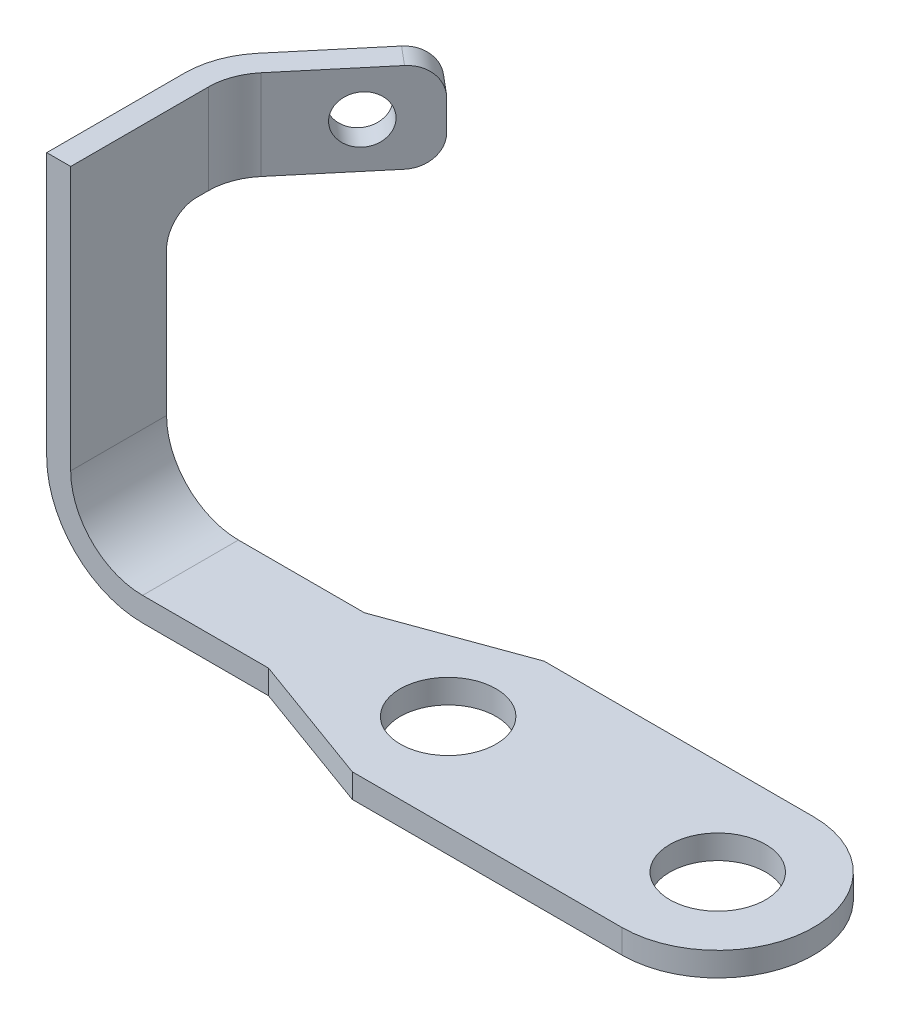
ISO-10303-21;
HEADER;
FILE_DESCRIPTION(('STEP AP214'),'2;1');
FILE_NAME('part.step','',(''),(''),'','','');
FILE_SCHEMA(('AUTOMOTIVE_DESIGN { 1 0 10303 214 1 1 1 1 }'));
ENDSEC;
DATA;
#1=APPLICATION_CONTEXT('core data for automotive mechanical design processes');
#2=APPLICATION_PROTOCOL_DEFINITION('international standard','automotive_design',2000,#1);
#3=PRODUCT_CONTEXT('',#1,'mechanical');
#4=PRODUCT('Part','Part','',(#3));
#5=PRODUCT_RELATED_PRODUCT_CATEGORY('part','',(#4));
#6=PRODUCT_DEFINITION_FORMATION('','',#4);
#7=PRODUCT_DEFINITION_CONTEXT('part definition',#1,'design');
#8=PRODUCT_DEFINITION('design','',#6,#7);
#9=PRODUCT_DEFINITION_SHAPE('','',#8);
#10=(LENGTH_UNIT() NAMED_UNIT(*) SI_UNIT(.MILLI.,.METRE.));
#11=(NAMED_UNIT(*) PLANE_ANGLE_UNIT() SI_UNIT($,.RADIAN.));
#12=(NAMED_UNIT(*) SI_UNIT($,.STERADIAN.) SOLID_ANGLE_UNIT());
#13=UNCERTAINTY_MEASURE_WITH_UNIT(LENGTH_MEASURE(1.E-05),#10,'distance_accuracy_value','');
#14=(GEOMETRIC_REPRESENTATION_CONTEXT(3) GLOBAL_UNCERTAINTY_ASSIGNED_CONTEXT((#13)) GLOBAL_UNIT_ASSIGNED_CONTEXT((#10,
#11,#12)) REPRESENTATION_CONTEXT('',''));
#15=CARTESIAN_POINT('',(0.,0.,0.));
#16=DIRECTION('',(0.,0.,1.));
#17=DIRECTION('',(1.,0.,0.));
#18=AXIS2_PLACEMENT_3D('',#15,#16,#17);
#19=CARTESIAN_POINT('',(-104.,16.,0.));
#20=DIRECTION('',(0.,0.,-1.));
#21=DIRECTION('',(-1.,0.,0.));
#22=AXIS2_PLACEMENT_3D('',#19,#20,#21);
#23=PLANE('',#22);
#24=DIRECTION('',(0.,1.,0.));
#25=VECTOR('',#24,1.);
#26=CARTESIAN_POINT('',(-120.,16.,0.));
#27=LINE('',#26,#25);
#28=CARTESIAN_POINT('',(-120.,16.,0.));
#29=VERTEX_POINT('',#28);
#30=CARTESIAN_POINT('',(-120.,40.,0.));
#31=VERTEX_POINT('',#30);
#32=EDGE_CURVE('E372',#29,#31,#27,.T.);
#33=ORIENTED_EDGE('',*,*,#32,.T.);
#34=DIRECTION('',(-1.,0.,0.));
#35=VECTOR('',#34,1.);
#36=CARTESIAN_POINT('',(-104.,40.,0.));
#37=LINE('',#36,#35);
#38=CARTESIAN_POINT('',(-116.,40.,0.));
#39=VERTEX_POINT('',#38);
#40=EDGE_CURVE('E406',#31,#39,#37,.F.);
#41=ORIENTED_EDGE('',*,*,#40,.T.);
#42=DIRECTION('',(0.,1.,0.));
#43=VECTOR('',#42,1.);
#44=CARTESIAN_POINT('',(-116.,16.,0.));
#45=LINE('',#44,#43);
#46=CARTESIAN_POINT('',(-116.,16.,0.));
#47=VERTEX_POINT('',#46);
#48=EDGE_CURVE('E365',#47,#39,#45,.T.);
#49=ORIENTED_EDGE('',*,*,#48,.F.);
#50=CARTESIAN_POINT('',(-104.,16.,0.));
#51=DIRECTION('',(0.,0.,1.));
#52=DIRECTION('',(1.,0.,0.));
#53=AXIS2_PLACEMENT_3D('',#50,#51,#52);
#54=CIRCLE('',#53,12.);
#55=CARTESIAN_POINT('',(-104.,3.99999999999999,0.));
#56=VERTEX_POINT('',#55);
#57=EDGE_CURVE('E350',#56,#47,#54,.F.);
#58=ORIENTED_EDGE('',*,*,#57,.F.);
#59=DIRECTION('',(-1.,0.,0.));
#60=VECTOR('',#59,1.);
#61=CARTESIAN_POINT('',(0.,4.,0.));
#62=LINE('',#61,#60);
#63=CARTESIAN_POINT('',(-82.979819355637,3.99999999999999,0.));
#64=VERTEX_POINT('',#63);
#65=EDGE_CURVE('E355',#64,#56,#62,.T.);
#66=ORIENTED_EDGE('',*,*,#65,.F.);
#67=DIRECTION('',(0.,1.,0.));
#68=VECTOR('',#67,1.);
#69=CARTESIAN_POINT('',(-82.979819355637,0.,0.));
#70=LINE('',#69,#68);
#71=CARTESIAN_POINT('',(-82.9798193556369,0.,0.));
#72=VERTEX_POINT('',#71);
#73=EDGE_CURVE('E325',#72,#64,#70,.T.);
#74=ORIENTED_EDGE('',*,*,#73,.F.);
#75=DIRECTION('',(-1.,0.,0.));
#76=VECTOR('',#75,1.);
#77=CARTESIAN_POINT('',(0.,0.,0.));
#78=LINE('',#77,#76);
#79=CARTESIAN_POINT('',(-104.,0.,0.));
#80=VERTEX_POINT('',#79);
#81=EDGE_CURVE('E373',#72,#80,#78,.T.);
#82=ORIENTED_EDGE('',*,*,#81,.T.);
#83=CARTESIAN_POINT('',(-104.,16.,0.));
#84=DIRECTION('',(0.,0.,-1.));
#85=DIRECTION('',(-1.,0.,0.));
#86=AXIS2_PLACEMENT_3D('',#83,#84,#85);
#87=CIRCLE('',#86,16.);
#88=EDGE_CURVE('E368',#80,#29,#87,.T.);
#89=ORIENTED_EDGE('',*,*,#88,.T.);
#90=EDGE_LOOP('',(#33,#41,#49,#58,#66,#74,#82,#89));
#91=FACE_BOUND('',#90,.T.);
#92=ADVANCED_FACE('F45',(#91),#23,.T.);
#93=CARTESIAN_POINT('',(-104.,16.,16.));
#94=DIRECTION('',(0.,0.,-1.));
#95=DIRECTION('',(-1.,0.,0.));
#96=AXIS2_PLACEMENT_3D('',#93,#94,#95);
#97=PLANE('',#96);
#98=DIRECTION('',(0.,1.,0.));
#99=VECTOR('',#98,1.);
#100=CARTESIAN_POINT('',(-82.9798193556369,0.,16.));
#101=LINE('',#100,#99);
#102=CARTESIAN_POINT('',(-82.9798193556369,0.,16.));
#103=VERTEX_POINT('',#102);
#104=CARTESIAN_POINT('',(-82.979819355637,3.99999999999999,16.));
#105=VERTEX_POINT('',#104);
#106=EDGE_CURVE('E322',#103,#105,#101,.T.);
#107=ORIENTED_EDGE('',*,*,#106,.T.);
#108=DIRECTION('',(-1.,0.,0.));
#109=VECTOR('',#108,1.);
#110=CARTESIAN_POINT('',(0.,4.,16.));
#111=LINE('',#110,#109);
#112=CARTESIAN_POINT('',(-104.,3.99999999999999,16.));
#113=VERTEX_POINT('',#112);
#114=EDGE_CURVE('E384',#105,#113,#111,.T.);
#115=ORIENTED_EDGE('',*,*,#114,.T.);
#116=CARTESIAN_POINT('',(-104.,16.,16.));
#117=DIRECTION('',(0.,0.,1.));
#118=DIRECTION('',(1.,0.,0.));
#119=AXIS2_PLACEMENT_3D('',#116,#117,#118);
#120=CIRCLE('',#119,12.);
#121=CARTESIAN_POINT('',(-116.,16.,16.));
#122=VERTEX_POINT('',#121);
#123=EDGE_CURVE('E380',#113,#122,#120,.F.);
#124=ORIENTED_EDGE('',*,*,#123,.T.);
#125=DIRECTION('',(0.,1.,0.));
#126=VECTOR('',#125,1.);
#127=CARTESIAN_POINT('',(-116.,16.,16.));
#128=LINE('',#127,#126);
#129=CARTESIAN_POINT('',(-116.,60.,16.));
#130=VERTEX_POINT('',#129);
#131=EDGE_CURVE('E383',#122,#130,#128,.T.);
#132=ORIENTED_EDGE('',*,*,#131,.T.);
#133=DIRECTION('',(1.,0.,0.));
#134=VECTOR('',#133,1.);
#135=CARTESIAN_POINT('',(-120.,60.,16.));
#136=LINE('',#135,#134);
#137=CARTESIAN_POINT('',(-120.,60.,16.));
#138=VERTEX_POINT('',#137);
#139=EDGE_CURVE('E342',#138,#130,#136,.T.);
#140=ORIENTED_EDGE('',*,*,#139,.F.);
#141=DIRECTION('',(0.,1.,0.));
#142=VECTOR('',#141,1.);
#143=CARTESIAN_POINT('',(-120.,16.,16.));
#144=LINE('',#143,#142);
#145=CARTESIAN_POINT('',(-120.,16.,16.));
#146=VERTEX_POINT('',#145);
#147=EDGE_CURVE('E341',#146,#138,#144,.T.);
#148=ORIENTED_EDGE('',*,*,#147,.F.);
#149=CARTESIAN_POINT('',(-104.,16.,16.));
#150=DIRECTION('',(0.,0.,-1.));
#151=DIRECTION('',(-1.,0.,0.));
#152=AXIS2_PLACEMENT_3D('',#149,#150,#151);
#153=CIRCLE('',#152,16.);
#154=CARTESIAN_POINT('',(-104.,0.,16.));
#155=VERTEX_POINT('',#154);
#156=EDGE_CURVE('E346',#155,#146,#153,.T.);
#157=ORIENTED_EDGE('',*,*,#156,.F.);
#158=DIRECTION('',(-1.,0.,0.));
#159=VECTOR('',#158,1.);
#160=CARTESIAN_POINT('',(0.,0.,16.));
#161=LINE('',#160,#159);
#162=EDGE_CURVE('E321',#103,#155,#161,.T.);
#163=ORIENTED_EDGE('',*,*,#162,.F.);
#164=EDGE_LOOP('',(#107,#115,#124,#132,#140,#148,#157,#163));
#165=FACE_BOUND('',#164,.T.);
#166=ADVANCED_FACE('F471',(#165),#97,.F.);
#167=CARTESIAN_POINT('',(0.,0.,16.));
#168=DIRECTION('',(0.,-1.,0.));
#169=DIRECTION('',(1.,0.,0.));
#170=AXIS2_PLACEMENT_3D('',#167,#168,#169);
#171=PLANE('',#170);
#172=CARTESIAN_POINT('',(-61.,0.,8.));
#173=DIRECTION('',(0.,1.,0.));
#174=DIRECTION('',(-1.,0.,0.));
#175=AXIS2_PLACEMENT_3D('',#172,#173,#174);
#176=CIRCLE('',#175,8.);
#177=CARTESIAN_POINT('',(-69.,0.,8.));
#178=VERTEX_POINT('',#177);
#179=EDGE_CURVE('E262',#178,#178,#176,.T.);
#180=ORIENTED_EDGE('',*,*,#179,.T.);
#181=EDGE_LOOP('',(#180));
#182=FACE_BOUND('',#181,.T.);
#183=CARTESIAN_POINT('',(-16.,0.,8.));
#184=DIRECTION('',(0.,1.,0.));
#185=DIRECTION('',(-1.,0.,0.));
#186=AXIS2_PLACEMENT_3D('',#183,#184,#185);
#187=CIRCLE('',#186,8.);
#188=CARTESIAN_POINT('',(-24.,0.,8.));
#189=VERTEX_POINT('',#188);
#190=EDGE_CURVE('E271',#189,#189,#187,.T.);
#191=ORIENTED_EDGE('',*,*,#190,.T.);
#192=EDGE_LOOP('',(#191));
#193=FACE_BOUND('',#192,.T.);
#194=CARTESIAN_POINT('',(-16.,0.,8.));
#195=DIRECTION('',(0.,1.,0.));
#196=DIRECTION('',(-1.,0.,0.));
#197=AXIS2_PLACEMENT_3D('',#194,#195,#196);
#198=CIRCLE('',#197,16.);
#199=CARTESIAN_POINT('',(-16.,0.,24.));
#200=VERTEX_POINT('',#199);
#201=CARTESIAN_POINT('',(-16.,0.,-8.));
#202=VERTEX_POINT('',#201);
#203=EDGE_CURVE('E282',#200,#202,#198,.T.);
#204=ORIENTED_EDGE('',*,*,#203,.F.);
#205=DIRECTION('',(-1.,0.,0.));
#206=VECTOR('',#205,1.);
#207=CARTESIAN_POINT('',(0.,0.,24.));
#208=LINE('',#207,#206);
#209=CARTESIAN_POINT('',(-61.,0.,24.));
#210=VERTEX_POINT('',#209);
#211=EDGE_CURVE('E278',#200,#210,#208,.T.);
#212=ORIENTED_EDGE('',*,*,#211,.T.);
#213=DIRECTION('',(-0.939692620785908,0.,-0.342020143325669));
#214=VECTOR('',#213,1.);
#215=CARTESIAN_POINT('',(-14.8490958011097,0.,40.7975554128672));
#216=LINE('',#215,#214);
#217=EDGE_CURVE('E295',#210,#103,#216,.T.);
#218=ORIENTED_EDGE('',*,*,#217,.T.);
#219=ORIENTED_EDGE('',*,*,#162,.T.);
#220=DIRECTION('',(0.,0.,-1.));
#221=VECTOR('',#220,1.);
#222=CARTESIAN_POINT('',(-104.,0.,16.));
#223=LINE('',#222,#221);
#224=EDGE_CURVE('E351',#155,#80,#223,.T.);
#225=ORIENTED_EDGE('',*,*,#224,.T.);
#226=ORIENTED_EDGE('',*,*,#81,.F.);
#227=DIRECTION('',(-0.939692620785908,0.,0.342020143325669));
#228=VECTOR('',#227,1.);
#229=CARTESIAN_POINT('',(-9.70679492361735,0.,-26.6691998679154));
#230=LINE('',#229,#228);
#231=CARTESIAN_POINT('',(-61.,0.,-8.));
#232=VERTEX_POINT('',#231);
#233=EDGE_CURVE('E291',#232,#72,#230,.T.);
#234=ORIENTED_EDGE('',*,*,#233,.F.);
#235=DIRECTION('',(-1.,0.,0.));
#236=VECTOR('',#235,1.);
#237=CARTESIAN_POINT('',(0.,0.,-8.));
#238=LINE('',#237,#236);
#239=EDGE_CURVE('E287',#202,#232,#238,.T.);
#240=ORIENTED_EDGE('',*,*,#239,.F.);
#241=EDGE_LOOP('',(#204,#212,#218,#219,#225,#226,#234,#240));
#242=FACE_BOUND('',#241,.T.);
#243=ADVANCED_FACE('F489',(#182,#193,#242),#171,.T.);
#244=CARTESIAN_POINT('',(0.,4.,16.));
#245=DIRECTION('',(0.,-1.,0.));
#246=DIRECTION('',(1.,0.,0.));
#247=AXIS2_PLACEMENT_3D('',#244,#245,#246);
#248=PLANE('',#247);
#249=CARTESIAN_POINT('',(-61.,3.99999999999999,8.));
#250=DIRECTION('',(0.,1.,0.));
#251=DIRECTION('',(-1.,0.,0.));
#252=AXIS2_PLACEMENT_3D('',#249,#250,#251);
#253=CIRCLE('',#252,8.);
#254=CARTESIAN_POINT('',(-69.,3.99999999999999,8.));
#255=VERTEX_POINT('',#254);
#256=EDGE_CURVE('E267',#255,#255,#253,.T.);
#257=ORIENTED_EDGE('',*,*,#256,.F.);
#258=EDGE_LOOP('',(#257));
#259=FACE_BOUND('',#258,.T.);
#260=CARTESIAN_POINT('',(-16.,4.,8.));
#261=DIRECTION('',(0.,1.,0.));
#262=DIRECTION('',(-1.,0.,0.));
#263=AXIS2_PLACEMENT_3D('',#260,#261,#262);
#264=CIRCLE('',#263,8.);
#265=CARTESIAN_POINT('',(-24.,4.,8.));
#266=VERTEX_POINT('',#265);
#267=EDGE_CURVE('E250',#266,#266,#264,.T.);
#268=ORIENTED_EDGE('',*,*,#267,.F.);
#269=EDGE_LOOP('',(#268));
#270=FACE_BOUND('',#269,.T.);
#271=CARTESIAN_POINT('',(-16.,4.,8.));
#272=DIRECTION('',(0.,1.,0.));
#273=DIRECTION('',(-1.,0.,0.));
#274=AXIS2_PLACEMENT_3D('',#271,#272,#273);
#275=CIRCLE('',#274,16.);
#276=CARTESIAN_POINT('',(-16.,4.,24.));
#277=VERTEX_POINT('',#276);
#278=CARTESIAN_POINT('',(-16.,4.,-8.));
#279=VERTEX_POINT('',#278);
#280=EDGE_CURVE('E303',#277,#279,#275,.T.);
#281=ORIENTED_EDGE('',*,*,#280,.T.);
#282=DIRECTION('',(-1.,0.,0.));
#283=VECTOR('',#282,1.);
#284=CARTESIAN_POINT('',(0.,4.,-8.));
#285=LINE('',#284,#283);
#286=CARTESIAN_POINT('',(-61.,3.99999999999999,-8.));
#287=VERTEX_POINT('',#286);
#288=EDGE_CURVE('E306',#279,#287,#285,.T.);
#289=ORIENTED_EDGE('',*,*,#288,.T.);
#290=DIRECTION('',(-0.939692620785908,0.,0.342020143325669));
#291=VECTOR('',#290,1.);
#292=CARTESIAN_POINT('',(-9.70679492361735,4.,-26.6691998679154));
#293=LINE('',#292,#291);
#294=EDGE_CURVE('E310',#287,#64,#293,.T.);
#295=ORIENTED_EDGE('',*,*,#294,.T.);
#296=ORIENTED_EDGE('',*,*,#65,.T.);
#297=DIRECTION('',(0.,0.,-1.));
#298=VECTOR('',#297,1.);
#299=CARTESIAN_POINT('',(-104.,3.99999999999999,16.));
#300=LINE('',#299,#298);
#301=EDGE_CURVE('E356',#113,#56,#300,.T.);
#302=ORIENTED_EDGE('',*,*,#301,.F.);
#303=ORIENTED_EDGE('',*,*,#114,.F.);
#304=DIRECTION('',(-0.939692620785908,0.,-0.342020143325669));
#305=VECTOR('',#304,1.);
#306=CARTESIAN_POINT('',(-14.8490958011097,4.,40.7975554128672));
#307=LINE('',#306,#305);
#308=CARTESIAN_POINT('',(-61.,3.99999999999999,24.));
#309=VERTEX_POINT('',#308);
#310=EDGE_CURVE('E283',#309,#105,#307,.T.);
#311=ORIENTED_EDGE('',*,*,#310,.F.);
#312=DIRECTION('',(-1.,0.,0.));
#313=VECTOR('',#312,1.);
#314=CARTESIAN_POINT('',(0.,4.,24.));
#315=LINE('',#314,#313);
#316=EDGE_CURVE('E266',#277,#309,#315,.T.);
#317=ORIENTED_EDGE('',*,*,#316,.F.);
#318=EDGE_LOOP('',(#281,#289,#295,#296,#302,#303,#311,#317));
#319=FACE_BOUND('',#318,.T.);
#320=ADVANCED_FACE('F495',(#259,#270,#319),#248,.F.);
#321=CARTESIAN_POINT('',(-116.,16.,16.));
#322=DIRECTION('',(-1.,0.,0.));
#323=DIRECTION('',(0.,-1.,0.));
#324=AXIS2_PLACEMENT_3D('',#321,#322,#323);
#325=PLANE('',#324);
#326=ORIENTED_EDGE('',*,*,#48,.T.);
#327=CARTESIAN_POINT('',(-116.,40.,-5.));
#328=DIRECTION('',(-1.,0.,0.));
#329=DIRECTION('',(0.,-1.,0.));
#330=AXIS2_PLACEMENT_3D('',#327,#328,#329);
#331=CIRCLE('',#330,5.);
#332=CARTESIAN_POINT('',(-116.,45.,-5.));
#333=VERTEX_POINT('',#332);
#334=EDGE_CURVE('E412',#39,#333,#331,.T.);
#335=ORIENTED_EDGE('',*,*,#334,.T.);
#336=DIRECTION('',(0.,0.,-1.));
#337=VECTOR('',#336,1.);
#338=CARTESIAN_POINT('',(-116.,45.,0.));
#339=LINE('',#338,#337);
#340=CARTESIAN_POINT('',(-116.,45.,-7.));
#341=VERTEX_POINT('',#340);
#342=EDGE_CURVE('E228',#333,#341,#339,.T.);
#343=ORIENTED_EDGE('',*,*,#342,.T.);
#344=DIRECTION('',(0.,1.,0.));
#345=VECTOR('',#344,1.);
#346=CARTESIAN_POINT('',(-116.,45.,-7.));
#347=LINE('',#346,#345);
#348=CARTESIAN_POINT('',(-116.,60.,-7.));
#349=VERTEX_POINT('',#348);
#350=EDGE_CURVE('E251',#341,#349,#347,.T.);
#351=ORIENTED_EDGE('',*,*,#350,.T.);
#352=DIRECTION('',(0.,0.,-1.));
#353=VECTOR('',#352,1.);
#354=CARTESIAN_POINT('',(-116.,60.,16.));
#355=LINE('',#354,#353);
#356=EDGE_CURVE('E338',#130,#349,#355,.T.);
#357=ORIENTED_EDGE('',*,*,#356,.F.);
#358=ORIENTED_EDGE('',*,*,#131,.F.);
#359=DIRECTION('',(0.,0.,-1.));
#360=VECTOR('',#359,1.);
#361=CARTESIAN_POINT('',(-116.,16.,16.));
#362=LINE('',#361,#360);
#363=EDGE_CURVE('E361',#122,#47,#362,.T.);
#364=ORIENTED_EDGE('',*,*,#363,.T.);
#365=EDGE_LOOP('',(#326,#335,#343,#351,#357,#358,#364));
#366=FACE_BOUND('',#365,.T.);
#367=ADVANCED_FACE('F498',(#366),#325,.F.);
#368=CARTESIAN_POINT('',(-120.,60.,16.));
#369=DIRECTION('',(0.,1.,0.));
#370=DIRECTION('',(0.,0.,1.));
#371=AXIS2_PLACEMENT_3D('',#368,#369,#370);
#372=PLANE('',#371);
#373=DIRECTION('',(0.642787609686543,0.,-0.766044443118975));
#374=VECTOR('',#373,1.);
#375=CARTESIAN_POINT('',(-113.66044443119,60.,-13.4278760968654));
#376=LINE('',#375,#374);
#377=CARTESIAN_POINT('',(-113.66044443119,60.,-13.4278760968654));
#378=VERTEX_POINT('',#377);
#379=CARTESIAN_POINT('',(-102.733055066519,60.,-26.450631629888));
#380=VERTEX_POINT('',#379);
#381=EDGE_CURVE('E236',#378,#380,#376,.T.);
#382=ORIENTED_EDGE('',*,*,#381,.T.);
#383=DIRECTION('',(0.766044443118977,0.,0.642787609686541));
#384=VECTOR('',#383,1.);
#385=CARTESIAN_POINT('',(-105.797232838994,60.,-29.0217820686342));
#386=LINE('',#385,#384);
#387=CARTESIAN_POINT('',(-105.797232838994,60.,-29.0217820686342));
#388=VERTEX_POINT('',#387);
#389=EDGE_CURVE('E12',#380,#388,#386,.F.);
#390=ORIENTED_EDGE('',*,*,#389,.T.);
#391=DIRECTION('',(0.642787609686543,0.,-0.766044443118975));
#392=VECTOR('',#391,1.);
#393=CARTESIAN_POINT('',(-116.724622203666,60.,-15.9990265356116));
#394=LINE('',#393,#392);
#395=CARTESIAN_POINT('',(-116.724622203666,60.,-15.9990265356116));
#396=VERTEX_POINT('',#395);
#397=EDGE_CURVE('E239',#396,#388,#394,.T.);
#398=ORIENTED_EDGE('',*,*,#397,.F.);
#399=CARTESIAN_POINT('',(-106.,60.,-7.));
#400=DIRECTION('',(0.,1.,0.));
#401=DIRECTION('',(1.,0.,0.));
#402=AXIS2_PLACEMENT_3D('',#399,#400,#401);
#403=CIRCLE('',#402,14.);
#404=CARTESIAN_POINT('',(-120.,60.,-7.));
#405=VERTEX_POINT('',#404);
#406=EDGE_CURVE('E210',#405,#396,#403,.F.);
#407=ORIENTED_EDGE('',*,*,#406,.F.);
#408=DIRECTION('',(0.,0.,-1.));
#409=VECTOR('',#408,1.);
#410=CARTESIAN_POINT('',(-120.,60.,16.));
#411=LINE('',#410,#409);
#412=EDGE_CURVE('E343',#138,#405,#411,.T.);
#413=ORIENTED_EDGE('',*,*,#412,.F.);
#414=ORIENTED_EDGE('',*,*,#139,.T.);
#415=ORIENTED_EDGE('',*,*,#356,.T.);
#416=CARTESIAN_POINT('',(-106.,60.,-7.));
#417=DIRECTION('',(0.,-1.,0.));
#418=DIRECTION('',(0.,0.,-1.));
#419=AXIS2_PLACEMENT_3D('',#416,#417,#418);
#420=CIRCLE('',#419,9.99999999999999);
#421=EDGE_CURVE('E222',#349,#378,#420,.T.);
#422=ORIENTED_EDGE('',*,*,#421,.T.);
#423=EDGE_LOOP('',(#382,#390,#398,#407,#413,#414,#415,#422));
#424=FACE_BOUND('',#423,.T.);
#425=ADVANCED_FACE('F474',(#424),#372,.T.);
#426=CARTESIAN_POINT('',(-120.,16.,16.));
#427=DIRECTION('',(-1.,0.,0.));
#428=DIRECTION('',(0.,-1.,0.));
#429=AXIS2_PLACEMENT_3D('',#426,#427,#428);
#430=PLANE('',#429);
#431=ORIENTED_EDGE('',*,*,#32,.F.);
#432=DIRECTION('',(0.,0.,-1.));
#433=VECTOR('',#432,1.);
#434=CARTESIAN_POINT('',(-120.,16.,16.));
#435=LINE('',#434,#433);
#436=EDGE_CURVE('E347',#146,#29,#435,.T.);
#437=ORIENTED_EDGE('',*,*,#436,.F.);
#438=ORIENTED_EDGE('',*,*,#147,.T.);
#439=ORIENTED_EDGE('',*,*,#412,.T.);
#440=DIRECTION('',(0.,1.,0.));
#441=VECTOR('',#440,1.);
#442=CARTESIAN_POINT('',(-120.,45.,-7.));
#443=LINE('',#442,#441);
#444=CARTESIAN_POINT('',(-120.,45.,-7.));
#445=VERTEX_POINT('',#444);
#446=EDGE_CURVE('E212',#445,#405,#443,.T.);
#447=ORIENTED_EDGE('',*,*,#446,.F.);
#448=DIRECTION('',(0.,0.,-1.));
#449=VECTOR('',#448,1.);
#450=CARTESIAN_POINT('',(-120.,45.,0.));
#451=LINE('',#450,#449);
#452=CARTESIAN_POINT('',(-120.,45.,-5.));
#453=VERTEX_POINT('',#452);
#454=EDGE_CURVE('E200',#453,#445,#451,.T.);
#455=ORIENTED_EDGE('',*,*,#454,.F.);
#456=CARTESIAN_POINT('',(-120.,40.,-5.));
#457=DIRECTION('',(-1.,0.,0.));
#458=DIRECTION('',(0.,-1.,0.));
#459=AXIS2_PLACEMENT_3D('',#456,#457,#458);
#460=CIRCLE('',#459,5.);
#461=EDGE_CURVE('E409',#453,#31,#460,.F.);
#462=ORIENTED_EDGE('',*,*,#461,.T.);
#463=EDGE_LOOP('',(#431,#437,#438,#439,#447,#455,#462));
#464=FACE_BOUND('',#463,.T.);
#465=ADVANCED_FACE('F459',(#464),#430,.T.);
#466=CARTESIAN_POINT('',(-104.,16.,16.));
#467=DIRECTION('',(0.,0.,-1.));
#468=DIRECTION('',(-1.,0.,0.));
#469=AXIS2_PLACEMENT_3D('',#466,#467,#468);
#470=CYLINDRICAL_SURFACE('',#469,16.);
#471=ORIENTED_EDGE('',*,*,#88,.F.);
#472=ORIENTED_EDGE('',*,*,#224,.F.);
#473=ORIENTED_EDGE('',*,*,#156,.T.);
#474=ORIENTED_EDGE('',*,*,#436,.T.);
#475=EDGE_LOOP('',(#471,#472,#473,#474));
#476=FACE_BOUND('',#475,.T.);
#477=ADVANCED_FACE('F466',(#476),#470,.T.);
#478=CARTESIAN_POINT('',(-104.,16.,16.));
#479=DIRECTION('',(0.,0.,-1.));
#480=DIRECTION('',(-1.,0.,0.));
#481=AXIS2_PLACEMENT_3D('',#478,#479,#480);
#482=CYLINDRICAL_SURFACE('',#481,12.);
#483=ORIENTED_EDGE('',*,*,#57,.T.);
#484=ORIENTED_EDGE('',*,*,#363,.F.);
#485=ORIENTED_EDGE('',*,*,#123,.F.);
#486=ORIENTED_EDGE('',*,*,#301,.T.);
#487=EDGE_LOOP('',(#483,#484,#485,#486));
#488=FACE_BOUND('',#487,.T.);
#489=ADVANCED_FACE('F492',(#488),#482,.F.);
#490=CARTESIAN_POINT('',(0.,0.,24.));
#491=DIRECTION('',(0.,0.,-1.));
#492=DIRECTION('',(-1.,0.,0.));
#493=AXIS2_PLACEMENT_3D('',#490,#491,#492);
#494=PLANE('',#493);
#495=ORIENTED_EDGE('',*,*,#316,.T.);
#496=DIRECTION('',(0.,1.,0.));
#497=VECTOR('',#496,1.);
#498=CARTESIAN_POINT('',(-61.,0.,24.));
#499=LINE('',#498,#497);
#500=EDGE_CURVE('E317',#210,#309,#499,.T.);
#501=ORIENTED_EDGE('',*,*,#500,.F.);
#502=ORIENTED_EDGE('',*,*,#211,.F.);
#503=DIRECTION('',(0.,1.,0.));
#504=VECTOR('',#503,1.);
#505=CARTESIAN_POINT('',(-16.,0.,24.));
#506=LINE('',#505,#504);
#507=EDGE_CURVE('E299',#200,#277,#506,.T.);
#508=ORIENTED_EDGE('',*,*,#507,.T.);
#509=EDGE_LOOP('',(#495,#501,#502,#508));
#510=FACE_BOUND('',#509,.T.);
#511=ADVANCED_FACE('F536',(#510),#494,.F.);
#512=CARTESIAN_POINT('',(-14.8490958011097,0.,40.7975554128672));
#513=DIRECTION('',(0.342020143325669,0.,-0.939692620785908));
#514=DIRECTION('',(-0.939692620785908,0.,-0.342020143325669));
#515=AXIS2_PLACEMENT_3D('',#512,#513,#514);
#516=PLANE('',#515);
#517=ORIENTED_EDGE('',*,*,#310,.T.);
#518=ORIENTED_EDGE('',*,*,#106,.F.);
#519=ORIENTED_EDGE('',*,*,#217,.F.);
#520=ORIENTED_EDGE('',*,*,#500,.T.);
#521=EDGE_LOOP('',(#517,#518,#519,#520));
#522=FACE_BOUND('',#521,.T.);
#523=ADVANCED_FACE('F532',(#522),#516,.F.);
#524=CARTESIAN_POINT('',(-9.70679492361735,0.,-26.6691998679154));
#525=DIRECTION('',(-0.342020143325669,0.,-0.939692620785908));
#526=DIRECTION('',(-0.939692620785908,0.,0.342020143325669));
#527=AXIS2_PLACEMENT_3D('',#524,#525,#526);
#528=PLANE('',#527);
#529=ORIENTED_EDGE('',*,*,#294,.F.);
#530=DIRECTION('',(0.,1.,0.));
#531=VECTOR('',#530,1.);
#532=CARTESIAN_POINT('',(-61.,0.,-8.));
#533=LINE('',#532,#531);
#534=EDGE_CURVE('E329',#232,#287,#533,.T.);
#535=ORIENTED_EDGE('',*,*,#534,.F.);
#536=ORIENTED_EDGE('',*,*,#233,.T.);
#537=ORIENTED_EDGE('',*,*,#73,.T.);
#538=EDGE_LOOP('',(#529,#535,#536,#537));
#539=FACE_BOUND('',#538,.T.);
#540=ADVANCED_FACE('F535',(#539),#528,.T.);
#541=CARTESIAN_POINT('',(0.,0.,-8.));
#542=DIRECTION('',(0.,0.,-1.));
#543=DIRECTION('',(-1.,0.,0.));
#544=AXIS2_PLACEMENT_3D('',#541,#542,#543);
#545=PLANE('',#544);
#546=ORIENTED_EDGE('',*,*,#288,.F.);
#547=DIRECTION('',(0.,1.,0.));
#548=VECTOR('',#547,1.);
#549=CARTESIAN_POINT('',(-16.,0.,-8.));
#550=LINE('',#549,#548);
#551=EDGE_CURVE('E332',#202,#279,#550,.T.);
#552=ORIENTED_EDGE('',*,*,#551,.F.);
#553=ORIENTED_EDGE('',*,*,#239,.T.);
#554=ORIENTED_EDGE('',*,*,#534,.T.);
#555=EDGE_LOOP('',(#546,#552,#553,#554));
#556=FACE_BOUND('',#555,.T.);
#557=ADVANCED_FACE('F540',(#556),#545,.T.);
#558=CARTESIAN_POINT('',(-16.,0.,8.));
#559=DIRECTION('',(0.,1.,0.));
#560=DIRECTION('',(-1.,0.,0.));
#561=AXIS2_PLACEMENT_3D('',#558,#559,#560);
#562=CYLINDRICAL_SURFACE('',#561,16.);
#563=ORIENTED_EDGE('',*,*,#551,.T.);
#564=ORIENTED_EDGE('',*,*,#280,.F.);
#565=ORIENTED_EDGE('',*,*,#507,.F.);
#566=ORIENTED_EDGE('',*,*,#203,.T.);
#567=EDGE_LOOP('',(#563,#564,#565,#566));
#568=FACE_BOUND('',#567,.T.);
#569=ADVANCED_FACE('F530',(#568),#562,.T.);
#570=CARTESIAN_POINT('',(-16.,0.,8.));
#571=DIRECTION('',(0.,1.,0.));
#572=DIRECTION('',(-1.,0.,0.));
#573=AXIS2_PLACEMENT_3D('',#570,#571,#572);
#574=CYLINDRICAL_SURFACE('',#573,8.);
#575=ORIENTED_EDGE('',*,*,#190,.F.);
#576=EDGE_LOOP('',(#575));
#577=FACE_BOUND('',#576,.T.);
#578=ORIENTED_EDGE('',*,*,#267,.T.);
#579=EDGE_LOOP('',(#578));
#580=FACE_BOUND('',#579,.T.);
#581=ADVANCED_FACE('F526',(#577,#580),#574,.F.);
#582=CARTESIAN_POINT('',(-61.,0.,8.));
#583=DIRECTION('',(0.,1.,0.));
#584=DIRECTION('',(-1.,0.,0.));
#585=AXIS2_PLACEMENT_3D('',#582,#583,#584);
#586=CYLINDRICAL_SURFACE('',#585,8.);
#587=ORIENTED_EDGE('',*,*,#179,.F.);
#588=EDGE_LOOP('',(#587));
#589=FACE_BOUND('',#588,.T.);
#590=ORIENTED_EDGE('',*,*,#256,.T.);
#591=EDGE_LOOP('',(#590));
#592=FACE_BOUND('',#591,.T.);
#593=ADVANCED_FACE('F522',(#589,#592),#586,.F.);
#594=CARTESIAN_POINT('',(-113.66044443119,45.,-13.4278760968654));
#595=DIRECTION('',(0.766044443118975,0.,0.642787609686543));
#596=DIRECTION('',(0.642787609686543,0.,-0.766044443118975));
#597=AXIS2_PLACEMENT_3D('',#594,#595,#596);
#598=PLANE('',#597);
#599=CARTESIAN_POINT('',(-105.946993114951,52.5,-22.6204094142931));
#600=DIRECTION('',(0.766044443118975,0.,0.642787609686543));
#601=DIRECTION('',(0.642787609686543,0.,-0.766044443118975));
#602=AXIS2_PLACEMENT_3D('',#599,#600,#601);
#603=CIRCLE('',#602,4.);
#604=CARTESIAN_POINT('',(-103.375842676205,52.5,-25.6845871867691));
#605=VERTEX_POINT('',#604);
#606=EDGE_CURVE('E785',#605,#605,#603,.T.);
#607=ORIENTED_EDGE('',*,*,#606,.F.);
#608=EDGE_LOOP('',(#607));
#609=FACE_BOUND('',#608,.T.);
#610=DIRECTION('',(0.642787609686543,0.,-0.766044443118975));
#611=VECTOR('',#610,1.);
#612=CARTESIAN_POINT('',(-113.66044443119,45.,-13.4278760968654));
#613=LINE('',#612,#611);
#614=CARTESIAN_POINT('',(-113.66044443119,45.,-13.4278760968654));
#615=VERTEX_POINT('',#614);
#616=CARTESIAN_POINT('',(-102.733055066519,45.,-26.450631629888));
#617=VERTEX_POINT('',#616);
#618=EDGE_CURVE('E218',#615,#617,#613,.T.);
#619=ORIENTED_EDGE('',*,*,#618,.T.);
#620=CARTESIAN_POINT('',(-102.733055066519,50.,-26.450631629888));
#621=DIRECTION('',(0.766044443118975,0.,0.642787609686543));
#622=DIRECTION('',(0.642787609686543,0.,-0.766044443118975));
#623=AXIS2_PLACEMENT_3D('',#620,#621,#622);
#624=CIRCLE('',#623,5.);
#625=CARTESIAN_POINT('',(-99.5191170180858,50.,-30.2808538454829));
#626=VERTEX_POINT('',#625);
#627=EDGE_CURVE('E421',#617,#626,#624,.T.);
#628=ORIENTED_EDGE('',*,*,#627,.T.);
#629=DIRECTION('',(0.,1.,0.));
#630=VECTOR('',#629,1.);
#631=CARTESIAN_POINT('',(-99.5191170180858,45.,-30.2808538454829));
#632=LINE('',#631,#630);
#633=CARTESIAN_POINT('',(-99.5191170180858,55.,-30.2808538454829));
#634=VERTEX_POINT('',#633);
#635=EDGE_CURVE('E235',#626,#634,#632,.T.);
#636=ORIENTED_EDGE('',*,*,#635,.T.);
#637=CARTESIAN_POINT('',(-102.733055066519,55.,-26.450631629888));
#638=DIRECTION('',(0.766044443118975,0.,0.642787609686543));
#639=DIRECTION('',(0.642787609686543,0.,-0.766044443118975));
#640=AXIS2_PLACEMENT_3D('',#637,#638,#639);
#641=CIRCLE('',#640,5.);
#642=EDGE_CURVE('E418',#634,#380,#641,.T.);
#643=ORIENTED_EDGE('',*,*,#642,.T.);
#644=ORIENTED_EDGE('',*,*,#381,.F.);
#645=DIRECTION('',(0.,1.,0.));
#646=VECTOR('',#645,1.);
#647=CARTESIAN_POINT('',(-113.66044443119,45.,-13.4278760968654));
#648=LINE('',#647,#646);
#649=EDGE_CURVE('E247',#615,#378,#648,.T.);
#650=ORIENTED_EDGE('',*,*,#649,.F.);
#651=EDGE_LOOP('',(#619,#628,#636,#643,#644,#650));
#652=FACE_BOUND('',#651,.T.);
#653=ADVANCED_FACE('F444',(#609,#652),#598,.T.);
#654=CARTESIAN_POINT('',(-106.,45.,-7.));
#655=DIRECTION('',(0.,1.,0.));
#656=DIRECTION('',(0.,0.,1.));
#657=AXIS2_PLACEMENT_3D('',#654,#655,#656);
#658=CYLINDRICAL_SURFACE('',#657,9.99999999999999);
#659=ORIENTED_EDGE('',*,*,#421,.F.);
#660=ORIENTED_EDGE('',*,*,#350,.F.);
#661=CARTESIAN_POINT('',(-106.,45.,-7.));
#662=DIRECTION('',(0.,-1.,0.));
#663=DIRECTION('',(0.,0.,-1.));
#664=AXIS2_PLACEMENT_3D('',#661,#662,#663);
#665=CIRCLE('',#664,9.99999999999999);
#666=EDGE_CURVE('E231',#341,#615,#665,.T.);
#667=ORIENTED_EDGE('',*,*,#666,.T.);
#668=ORIENTED_EDGE('',*,*,#649,.T.);
#669=EDGE_LOOP('',(#659,#660,#667,#668));
#670=FACE_BOUND('',#669,.T.);
#671=ADVANCED_FACE('F448',(#670),#658,.F.);
#672=CARTESIAN_POINT('',(-106.,45.,-7.));
#673=DIRECTION('',(0.,1.,0.));
#674=DIRECTION('',(0.,0.,1.));
#675=AXIS2_PLACEMENT_3D('',#672,#673,#674);
#676=CYLINDRICAL_SURFACE('',#675,14.);
#677=ORIENTED_EDGE('',*,*,#406,.T.);
#678=DIRECTION('',(0.,1.,0.));
#679=VECTOR('',#678,1.);
#680=CARTESIAN_POINT('',(-116.724622203666,45.,-15.9990265356116));
#681=LINE('',#680,#679);
#682=CARTESIAN_POINT('',(-116.724622203666,45.,-15.9990265356116));
#683=VERTEX_POINT('',#682);
#684=EDGE_CURVE('E207',#683,#396,#681,.T.);
#685=ORIENTED_EDGE('',*,*,#684,.F.);
#686=CARTESIAN_POINT('',(-106.,45.,-7.));
#687=DIRECTION('',(0.,1.,0.));
#688=DIRECTION('',(1.,0.,0.));
#689=AXIS2_PLACEMENT_3D('',#686,#687,#688);
#690=CIRCLE('',#689,14.);
#691=EDGE_CURVE('E191',#445,#683,#690,.F.);
#692=ORIENTED_EDGE('',*,*,#691,.F.);
#693=ORIENTED_EDGE('',*,*,#446,.T.);
#694=EDGE_LOOP('',(#677,#685,#692,#693));
#695=FACE_BOUND('',#694,.T.);
#696=ADVANCED_FACE('F208',(#695),#676,.T.);
#697=CARTESIAN_POINT('',(-116.724622203666,45.,-15.9990265356116));
#698=DIRECTION('',(0.766044443118975,0.,0.642787609686543));
#699=DIRECTION('',(0.642787609686543,0.,-0.766044443118975));
#700=AXIS2_PLACEMENT_3D('',#697,#698,#699);
#701=PLANE('',#700);
#702=CARTESIAN_POINT('',(-109.011170887427,52.5,-25.1915598530393));
#703=DIRECTION('',(0.766044443118975,0.,0.642787609686543));
#704=DIRECTION('',(0.642787609686543,0.,-0.766044443118975));
#705=AXIS2_PLACEMENT_3D('',#702,#703,#704);
#706=CIRCLE('',#705,4.);
#707=CARTESIAN_POINT('',(-106.440020448681,52.5,-28.2557376255152));
#708=VERTEX_POINT('',#707);
#709=EDGE_CURVE('E49',#708,#708,#706,.T.);
#710=ORIENTED_EDGE('',*,*,#709,.T.);
#711=EDGE_LOOP('',(#710));
#712=FACE_BOUND('',#711,.T.);
#713=DIRECTION('',(0.,1.,0.));
#714=VECTOR('',#713,1.);
#715=CARTESIAN_POINT('',(-102.583294790562,45.,-32.852004284229));
#716=LINE('',#715,#714);
#717=CARTESIAN_POINT('',(-102.583294790562,50.,-32.852004284229));
#718=VERTEX_POINT('',#717);
#719=CARTESIAN_POINT('',(-102.583294790562,55.,-32.852004284229));
#720=VERTEX_POINT('',#719);
#721=EDGE_CURVE('E213',#718,#720,#716,.T.);
#722=ORIENTED_EDGE('',*,*,#721,.F.);
#723=CARTESIAN_POINT('',(-105.797232838994,50.,-29.0217820686342));
#724=DIRECTION('',(0.766044443118975,0.,0.642787609686543));
#725=DIRECTION('',(0.642787609686543,0.,-0.766044443118975));
#726=AXIS2_PLACEMENT_3D('',#723,#724,#725);
#727=CIRCLE('',#726,5.);
#728=CARTESIAN_POINT('',(-105.797232838994,45.,-29.0217820686342));
#729=VERTEX_POINT('',#728);
#730=EDGE_CURVE('E55',#718,#729,#727,.F.);
#731=ORIENTED_EDGE('',*,*,#730,.T.);
#732=DIRECTION('',(0.642787609686543,0.,-0.766044443118975));
#733=VECTOR('',#732,1.);
#734=CARTESIAN_POINT('',(-116.724622203666,45.,-15.9990265356116));
#735=LINE('',#734,#733);
#736=EDGE_CURVE('E196',#683,#729,#735,.T.);
#737=ORIENTED_EDGE('',*,*,#736,.F.);
#738=ORIENTED_EDGE('',*,*,#684,.T.);
#739=ORIENTED_EDGE('',*,*,#397,.T.);
#740=CARTESIAN_POINT('',(-105.797232838994,55.,-29.0217820686342));
#741=DIRECTION('',(0.766044443118975,0.,0.642787609686543));
#742=DIRECTION('',(0.642787609686543,0.,-0.766044443118975));
#743=AXIS2_PLACEMENT_3D('',#740,#741,#742);
#744=CIRCLE('',#743,5.);
#745=EDGE_CURVE('E67',#388,#720,#744,.F.);
#746=ORIENTED_EDGE('',*,*,#745,.T.);
#747=EDGE_LOOP('',(#722,#731,#737,#738,#739,#746));
#748=FACE_BOUND('',#747,.T.);
#749=ADVANCED_FACE('F215',(#712,#748),#701,.F.);
#750=CARTESIAN_POINT('',(-102.583294790562,45.,-32.852004284229));
#751=DIRECTION('',(-0.642787609686541,0.,0.766044443118977));
#752=DIRECTION('',(0.766044443118977,0.,0.642787609686541));
#753=AXIS2_PLACEMENT_3D('',#750,#751,#752);
#754=PLANE('',#753);
#755=ORIENTED_EDGE('',*,*,#635,.F.);
#756=DIRECTION('',(0.766044443118977,0.,0.642787609686541));
#757=VECTOR('',#756,1.);
#758=CARTESIAN_POINT('',(-102.583294790562,50.,-32.852004284229));
#759=LINE('',#758,#757);
#760=EDGE_CURVE('E428',#626,#718,#759,.F.);
#761=ORIENTED_EDGE('',*,*,#760,.T.);
#762=ORIENTED_EDGE('',*,*,#721,.T.);
#763=DIRECTION('',(0.766044443118977,0.,0.642787609686541));
#764=VECTOR('',#763,1.);
#765=CARTESIAN_POINT('',(-99.5191170180858,55.,-30.2808538454829));
#766=LINE('',#765,#764);
#767=EDGE_CURVE('E424',#720,#634,#766,.T.);
#768=ORIENTED_EDGE('',*,*,#767,.T.);
#769=EDGE_LOOP('',(#755,#761,#762,#768));
#770=FACE_BOUND('',#769,.T.);
#771=ADVANCED_FACE('F437',(#770),#754,.F.);
#772=CARTESIAN_POINT('',(-106.,45.,-7.));
#773=DIRECTION('',(0.,1.,0.));
#774=DIRECTION('',(1.,0.,0.));
#775=AXIS2_PLACEMENT_3D('',#772,#773,#774);
#776=PLANE('',#775);
#777=ORIENTED_EDGE('',*,*,#736,.T.);
#778=DIRECTION('',(0.766044443118977,0.,0.642787609686541));
#779=VECTOR('',#778,1.);
#780=CARTESIAN_POINT('',(-95.0726106353288,45.,-20.0227555330226));
#781=LINE('',#780,#779);
#782=EDGE_CURVE('E415',#729,#617,#781,.T.);
#783=ORIENTED_EDGE('',*,*,#782,.T.);
#784=ORIENTED_EDGE('',*,*,#618,.F.);
#785=ORIENTED_EDGE('',*,*,#666,.F.);
#786=ORIENTED_EDGE('',*,*,#342,.F.);
#787=DIRECTION('',(-1.,0.,0.));
#788=VECTOR('',#787,1.);
#789=CARTESIAN_POINT('',(-106.,45.,-5.));
#790=LINE('',#789,#788);
#791=EDGE_CURVE('E360',#333,#453,#790,.T.);
#792=ORIENTED_EDGE('',*,*,#791,.T.);
#793=ORIENTED_EDGE('',*,*,#454,.T.);
#794=ORIENTED_EDGE('',*,*,#691,.T.);
#795=EDGE_LOOP('',(#777,#783,#784,#785,#786,#792,#793,#794));
#796=FACE_BOUND('',#795,.T.);
#797=ADVANCED_FACE('F193',(#796),#776,.F.);
#798=CARTESIAN_POINT('',(-106.,40.,-5.));
#799=DIRECTION('',(-1.,0.,0.));
#800=DIRECTION('',(0.,0.,1.));
#801=AXIS2_PLACEMENT_3D('',#798,#799,#800);
#802=CYLINDRICAL_SURFACE('',#801,5.);
#803=ORIENTED_EDGE('',*,*,#334,.F.);
#804=ORIENTED_EDGE('',*,*,#40,.F.);
#805=ORIENTED_EDGE('',*,*,#461,.F.);
#806=ORIENTED_EDGE('',*,*,#791,.F.);
#807=EDGE_LOOP('',(#803,#804,#805,#806));
#808=FACE_BOUND('',#807,.T.);
#809=ADVANCED_FACE('F455',(#808),#802,.F.);
#810=CARTESIAN_POINT('',(-95.0726106353288,50.,-20.0227555330226));
#811=DIRECTION('',(0.766044443118977,0.,0.642787609686541));
#812=DIRECTION('',(0.642787609686541,0.,-0.766044443118977));
#813=AXIS2_PLACEMENT_3D('',#810,#811,#812);
#814=CYLINDRICAL_SURFACE('',#813,5.);
#815=ORIENTED_EDGE('',*,*,#730,.F.);
#816=ORIENTED_EDGE('',*,*,#760,.F.);
#817=ORIENTED_EDGE('',*,*,#627,.F.);
#818=ORIENTED_EDGE('',*,*,#782,.F.);
#819=EDGE_LOOP('',(#815,#816,#817,#818));
#820=FACE_BOUND('',#819,.T.);
#821=ADVANCED_FACE('F440',(#820),#814,.T.);
#822=CARTESIAN_POINT('',(-105.797232838994,55.,-29.0217820686342));
#823=DIRECTION('',(-0.766044443118977,0.,-0.642787609686541));
#824=DIRECTION('',(-0.642787609686541,0.,0.766044443118977));
#825=AXIS2_PLACEMENT_3D('',#822,#823,#824);
#826=CYLINDRICAL_SURFACE('',#825,5.);
#827=ORIENTED_EDGE('',*,*,#745,.F.);
#828=ORIENTED_EDGE('',*,*,#389,.F.);
#829=ORIENTED_EDGE('',*,*,#642,.F.);
#830=ORIENTED_EDGE('',*,*,#767,.F.);
#831=EDGE_LOOP('',(#827,#828,#829,#830));
#832=FACE_BOUND('',#831,.T.);
#833=ADVANCED_FACE('F47',(#832),#826,.T.);
#834=CARTESIAN_POINT('',(-117.437659761736,52.5,-32.2622235595913));
#835=DIRECTION('',(0.766044443118975,0.,0.642787609686543));
#836=DIRECTION('',(0.642787609686543,0.,-0.766044443118975));
#837=AXIS2_PLACEMENT_3D('',#834,#835,#836);
#838=CYLINDRICAL_SURFACE('',#837,4.);
#839=ORIENTED_EDGE('',*,*,#606,.T.);
#840=EDGE_LOOP('',(#839));
#841=FACE_BOUND('',#840,.T.);
#842=ORIENTED_EDGE('',*,*,#709,.F.);
#843=EDGE_LOOP('',(#842));
#844=FACE_BOUND('',#843,.T.);
#845=ADVANCED_FACE('F477',(#841,#844),#838,.F.);
#846=CLOSED_SHELL('',(#92,#166,#243,#320,#367,#425,#465,#477,#489,#511,#523,#540,#557,#569,#581,
#593,#653,#671,#696,#749,#771,#797,#809,#821,#833,#845));
#847=MANIFOLD_SOLID_BREP('B2',#846);
#848=ADVANCED_BREP_SHAPE_REPRESENTATION('',(#18,#847),#14);
#849=SHAPE_DEFINITION_REPRESENTATION(#9,#848);
ENDSEC;
END-ISO-10303-21;
